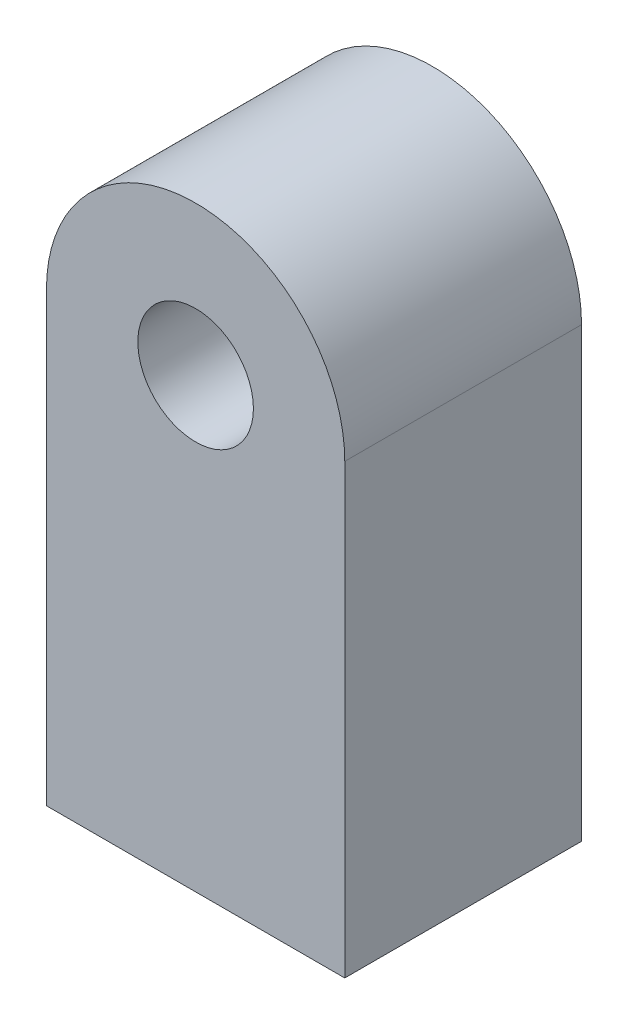
ISO-10303-21;
HEADER;
FILE_DESCRIPTION(('STEP AP214'),'2;1');
FILE_NAME('part.step','',(''),(''),'','','');
FILE_SCHEMA(('AUTOMOTIVE_DESIGN { 1 0 10303 214 1 1 1 1 }'));
ENDSEC;
DATA;
#1=APPLICATION_CONTEXT('core data for automotive mechanical design processes');
#2=APPLICATION_PROTOCOL_DEFINITION('international standard','automotive_design',2000,#1);
#3=PRODUCT_CONTEXT('',#1,'mechanical');
#4=PRODUCT('Part','Part','',(#3));
#5=PRODUCT_RELATED_PRODUCT_CATEGORY('part','',(#4));
#6=PRODUCT_DEFINITION_FORMATION('','',#4);
#7=PRODUCT_DEFINITION_CONTEXT('part definition',#1,'design');
#8=PRODUCT_DEFINITION('design','',#6,#7);
#9=PRODUCT_DEFINITION_SHAPE('','',#8);
#10=(LENGTH_UNIT() NAMED_UNIT(*) SI_UNIT(.MILLI.,.METRE.));
#11=(NAMED_UNIT(*) PLANE_ANGLE_UNIT() SI_UNIT($,.RADIAN.));
#12=(NAMED_UNIT(*) SI_UNIT($,.STERADIAN.) SOLID_ANGLE_UNIT());
#13=UNCERTAINTY_MEASURE_WITH_UNIT(LENGTH_MEASURE(1.E-05),#10,'distance_accuracy_value','');
#14=(GEOMETRIC_REPRESENTATION_CONTEXT(3) GLOBAL_UNCERTAINTY_ASSIGNED_CONTEXT((#13)) GLOBAL_UNIT_ASSIGNED_CONTEXT((#10,
#11,#12)) REPRESENTATION_CONTEXT('',''));
#15=CARTESIAN_POINT('',(0.,0.,0.));
#16=DIRECTION('',(0.,0.,1.));
#17=DIRECTION('',(1.,0.,0.));
#18=AXIS2_PLACEMENT_3D('',#15,#16,#17);
#19=CARTESIAN_POINT('',(0.,12.,6.35));
#20=DIRECTION('',(0.,0.,-1.));
#21=DIRECTION('',(-1.,0.,0.));
#22=AXIS2_PLACEMENT_3D('',#19,#20,#21);
#23=PLANE('',#22);
#24=DIRECTION('',(0.,-1.,0.));
#25=VECTOR('',#24,1.);
#26=CARTESIAN_POINT('',(-4.,0.,6.35));
#27=LINE('',#26,#25);
#28=CARTESIAN_POINT('',(-4.,12.,6.35));
#29=VERTEX_POINT('',#28);
#30=CARTESIAN_POINT('',(-4.,0.,6.35));
#31=VERTEX_POINT('',#30);
#32=EDGE_CURVE('E88',#29,#31,#27,.T.);
#33=ORIENTED_EDGE('',*,*,#32,.T.);
#34=DIRECTION('',(1.,0.,0.));
#35=VECTOR('',#34,1.);
#36=CARTESIAN_POINT('',(-4.,0.,6.35));
#37=LINE('',#36,#35);
#38=CARTESIAN_POINT('',(4.,0.,6.35));
#39=VERTEX_POINT('',#38);
#40=EDGE_CURVE('E83',#31,#39,#37,.T.);
#41=ORIENTED_EDGE('',*,*,#40,.T.);
#42=DIRECTION('',(0.,1.,0.));
#43=VECTOR('',#42,1.);
#44=CARTESIAN_POINT('',(4.,0.,6.35));
#45=LINE('',#44,#43);
#46=CARTESIAN_POINT('',(4.,12.,6.35));
#47=VERTEX_POINT('',#46);
#48=EDGE_CURVE('E86',#39,#47,#45,.T.);
#49=ORIENTED_EDGE('',*,*,#48,.T.);
#50=CARTESIAN_POINT('',(0.,12.,6.35));
#51=DIRECTION('',(0.,0.,1.));
#52=DIRECTION('',(-1.,0.,0.));
#53=AXIS2_PLACEMENT_3D('',#50,#51,#52);
#54=CIRCLE('',#53,4.);
#55=EDGE_CURVE('E53',#47,#29,#54,.T.);
#56=ORIENTED_EDGE('',*,*,#55,.T.);
#57=EDGE_LOOP('',(#33,#41,#49,#56));
#58=FACE_BOUND('',#57,.T.);
#59=CARTESIAN_POINT('',(0.,12.,6.35));
#60=DIRECTION('',(0.,0.,1.));
#61=DIRECTION('',(1.,0.,0.));
#62=AXIS2_PLACEMENT_3D('',#59,#60,#61);
#63=CIRCLE('',#62,1.55);
#64=CARTESIAN_POINT('',(1.55,12.,6.35));
#65=VERTEX_POINT('',#64);
#66=EDGE_CURVE('E114',#65,#65,#63,.T.);
#67=ORIENTED_EDGE('',*,*,#66,.F.);
#68=EDGE_LOOP('',(#67));
#69=FACE_BOUND('',#68,.T.);
#70=ADVANCED_FACE('F36',(#58,#69),#23,.F.);
#71=CARTESIAN_POINT('',(0.,12.,0.));
#72=DIRECTION('',(0.,0.,-1.));
#73=DIRECTION('',(-1.,0.,0.));
#74=AXIS2_PLACEMENT_3D('',#71,#72,#73);
#75=PLANE('',#74);
#76=DIRECTION('',(0.,-1.,0.));
#77=VECTOR('',#76,1.);
#78=CARTESIAN_POINT('',(-4.,0.,0.));
#79=LINE('',#78,#77);
#80=CARTESIAN_POINT('',(-4.,12.,0.));
#81=VERTEX_POINT('',#80);
#82=CARTESIAN_POINT('',(-4.,0.,0.));
#83=VERTEX_POINT('',#82);
#84=EDGE_CURVE('E118',#81,#83,#79,.T.);
#85=ORIENTED_EDGE('',*,*,#84,.F.);
#86=CARTESIAN_POINT('',(0.,12.,0.));
#87=DIRECTION('',(0.,0.,1.));
#88=DIRECTION('',(-1.,0.,0.));
#89=AXIS2_PLACEMENT_3D('',#86,#87,#88);
#90=CIRCLE('',#89,4.);
#91=CARTESIAN_POINT('',(4.,12.,0.));
#92=VERTEX_POINT('',#91);
#93=EDGE_CURVE('E76',#92,#81,#90,.T.);
#94=ORIENTED_EDGE('',*,*,#93,.F.);
#95=DIRECTION('',(0.,1.,0.));
#96=VECTOR('',#95,1.);
#97=CARTESIAN_POINT('',(4.,0.,0.));
#98=LINE('',#97,#96);
#99=CARTESIAN_POINT('',(4.,0.,0.));
#100=VERTEX_POINT('',#99);
#101=EDGE_CURVE('E70',#100,#92,#98,.T.);
#102=ORIENTED_EDGE('',*,*,#101,.F.);
#103=DIRECTION('',(1.,0.,0.));
#104=VECTOR('',#103,1.);
#105=CARTESIAN_POINT('',(-4.,0.,0.));
#106=LINE('',#105,#104);
#107=EDGE_CURVE('E93',#83,#100,#106,.T.);
#108=ORIENTED_EDGE('',*,*,#107,.F.);
#109=EDGE_LOOP('',(#85,#94,#102,#108));
#110=FACE_BOUND('',#109,.T.);
#111=CARTESIAN_POINT('',(0.,12.,0.));
#112=DIRECTION('',(0.,0.,1.));
#113=DIRECTION('',(1.,0.,0.));
#114=AXIS2_PLACEMENT_3D('',#111,#112,#113);
#115=CIRCLE('',#114,1.55);
#116=CARTESIAN_POINT('',(1.55,12.,0.));
#117=VERTEX_POINT('',#116);
#118=EDGE_CURVE('E112',#117,#117,#115,.T.);
#119=ORIENTED_EDGE('',*,*,#118,.T.);
#120=EDGE_LOOP('',(#119));
#121=FACE_BOUND('',#120,.T.);
#122=ADVANCED_FACE('F131',(#110,#121),#75,.T.);
#123=CARTESIAN_POINT('',(-4.,0.,6.35));
#124=DIRECTION('',(1.,0.,0.));
#125=DIRECTION('',(0.,0.,-1.));
#126=AXIS2_PLACEMENT_3D('',#123,#124,#125);
#127=PLANE('',#126);
#128=ORIENTED_EDGE('',*,*,#84,.T.);
#129=DIRECTION('',(0.,0.,-1.));
#130=VECTOR('',#129,1.);
#131=CARTESIAN_POINT('',(-4.,0.,6.35));
#132=LINE('',#131,#130);
#133=EDGE_CURVE('E12',#31,#83,#132,.T.);
#134=ORIENTED_EDGE('',*,*,#133,.F.);
#135=ORIENTED_EDGE('',*,*,#32,.F.);
#136=DIRECTION('',(0.,0.,-1.));
#137=VECTOR('',#136,1.);
#138=CARTESIAN_POINT('',(-4.,12.,6.35));
#139=LINE('',#138,#137);
#140=EDGE_CURVE('E99',#29,#81,#139,.T.);
#141=ORIENTED_EDGE('',*,*,#140,.T.);
#142=EDGE_LOOP('',(#128,#134,#135,#141));
#143=FACE_BOUND('',#142,.T.);
#144=ADVANCED_FACE('F38',(#143),#127,.F.);
#145=CARTESIAN_POINT('',(-4.,0.,6.35));
#146=DIRECTION('',(0.,1.,0.));
#147=DIRECTION('',(-1.,0.,0.));
#148=AXIS2_PLACEMENT_3D('',#145,#146,#147);
#149=PLANE('',#148);
#150=ORIENTED_EDGE('',*,*,#107,.T.);
#151=DIRECTION('',(0.,0.,-1.));
#152=VECTOR('',#151,1.);
#153=CARTESIAN_POINT('',(4.,0.,6.35));
#154=LINE('',#153,#152);
#155=EDGE_CURVE('E45',#39,#100,#154,.T.);
#156=ORIENTED_EDGE('',*,*,#155,.F.);
#157=ORIENTED_EDGE('',*,*,#40,.F.);
#158=ORIENTED_EDGE('',*,*,#133,.T.);
#159=EDGE_LOOP('',(#150,#156,#157,#158));
#160=FACE_BOUND('',#159,.T.);
#161=ADVANCED_FACE('F92',(#160),#149,.F.);
#162=CARTESIAN_POINT('',(4.,0.,6.35));
#163=DIRECTION('',(-1.,0.,0.));
#164=DIRECTION('',(0.,0.,1.));
#165=AXIS2_PLACEMENT_3D('',#162,#163,#164);
#166=PLANE('',#165);
#167=ORIENTED_EDGE('',*,*,#101,.T.);
#168=DIRECTION('',(0.,0.,-1.));
#169=VECTOR('',#168,1.);
#170=CARTESIAN_POINT('',(4.,12.,6.35));
#171=LINE('',#170,#169);
#172=EDGE_CURVE('E94',#47,#92,#171,.T.);
#173=ORIENTED_EDGE('',*,*,#172,.F.);
#174=ORIENTED_EDGE('',*,*,#48,.F.);
#175=ORIENTED_EDGE('',*,*,#155,.T.);
#176=EDGE_LOOP('',(#167,#173,#174,#175));
#177=FACE_BOUND('',#176,.T.);
#178=ADVANCED_FACE('F95',(#177),#166,.F.);
#179=CARTESIAN_POINT('',(0.,12.,6.35));
#180=DIRECTION('',(0.,0.,-1.));
#181=DIRECTION('',(-1.,0.,0.));
#182=AXIS2_PLACEMENT_3D('',#179,#180,#181);
#183=CYLINDRICAL_SURFACE('',#182,4.);
#184=ORIENTED_EDGE('',*,*,#93,.T.);
#185=ORIENTED_EDGE('',*,*,#140,.F.);
#186=ORIENTED_EDGE('',*,*,#55,.F.);
#187=ORIENTED_EDGE('',*,*,#172,.T.);
#188=EDGE_LOOP('',(#184,#185,#186,#187));
#189=FACE_BOUND('',#188,.T.);
#190=ADVANCED_FACE('F129',(#189),#183,.T.);
#191=CARTESIAN_POINT('',(0.,12.,6.35));
#192=DIRECTION('',(0.,0.,-1.));
#193=DIRECTION('',(-1.,0.,0.));
#194=AXIS2_PLACEMENT_3D('',#191,#192,#193);
#195=CYLINDRICAL_SURFACE('',#194,1.55);
#196=ORIENTED_EDGE('',*,*,#66,.T.);
#197=EDGE_LOOP('',(#196));
#198=FACE_BOUND('',#197,.T.);
#199=ORIENTED_EDGE('',*,*,#118,.F.);
#200=EDGE_LOOP('',(#199));
#201=FACE_BOUND('',#200,.T.);
#202=ADVANCED_FACE('F144',(#198,#201),#195,.F.);
#203=CLOSED_SHELL('',(#70,#122,#144,#161,#178,#190,#202));
#204=MANIFOLD_SOLID_BREP('B2',#203);
#205=ADVANCED_BREP_SHAPE_REPRESENTATION('',(#18,#204),#14);
#206=SHAPE_DEFINITION_REPRESENTATION(#9,#205);
ENDSEC;
END-ISO-10303-21;
